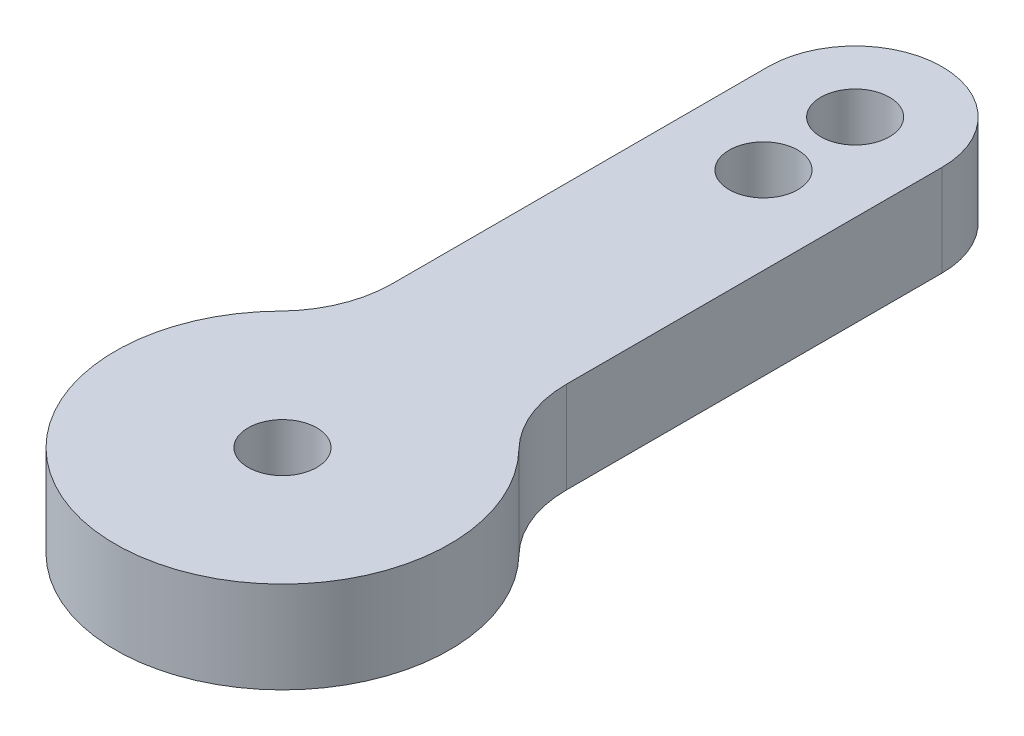
ISO-10303-21;
HEADER;
FILE_DESCRIPTION(('STEP AP214'),'2;1');
FILE_NAME('part.step','',(''),(''),'','','');
FILE_SCHEMA(('AUTOMOTIVE_DESIGN { 1 0 10303 214 1 1 1 1 }'));
ENDSEC;
DATA;
#1=APPLICATION_CONTEXT('core data for automotive mechanical design processes');
#2=APPLICATION_PROTOCOL_DEFINITION('international standard','automotive_design',2000,#1);
#3=PRODUCT_CONTEXT('',#1,'mechanical');
#4=PRODUCT('Part','Part','',(#3));
#5=PRODUCT_RELATED_PRODUCT_CATEGORY('part','',(#4));
#6=PRODUCT_DEFINITION_FORMATION('','',#4);
#7=PRODUCT_DEFINITION_CONTEXT('part definition',#1,'design');
#8=PRODUCT_DEFINITION('design','',#6,#7);
#9=PRODUCT_DEFINITION_SHAPE('','',#8);
#10=(LENGTH_UNIT() NAMED_UNIT(*) SI_UNIT(.MILLI.,.METRE.));
#11=(NAMED_UNIT(*) PLANE_ANGLE_UNIT() SI_UNIT($,.RADIAN.));
#12=(NAMED_UNIT(*) SI_UNIT($,.STERADIAN.) SOLID_ANGLE_UNIT());
#13=UNCERTAINTY_MEASURE_WITH_UNIT(LENGTH_MEASURE(1.E-05),#10,'distance_accuracy_value','');
#14=(GEOMETRIC_REPRESENTATION_CONTEXT(3) GLOBAL_UNCERTAINTY_ASSIGNED_CONTEXT((#13)) GLOBAL_UNIT_ASSIGNED_CONTEXT((#10,
#11,#12)) REPRESENTATION_CONTEXT('',''));
#15=CARTESIAN_POINT('',(0.,0.,0.));
#16=DIRECTION('',(0.,0.,1.));
#17=DIRECTION('',(1.,0.,0.));
#18=AXIS2_PLACEMENT_3D('',#15,#16,#17);
#19=CARTESIAN_POINT('',(8.8,0.,-8.59360227145753));
#20=DIRECTION('',(0.,1.,0.));
#21=DIRECTION('',(0.,0.,1.));
#22=AXIS2_PLACEMENT_3D('',#19,#20,#21);
#23=PLANE('',#22);
#24=CARTESIAN_POINT('',(0.,0.,0.));
#25=DIRECTION('',(0.,-1.,0.));
#26=DIRECTION('',(0.,0.,-1.));
#27=AXIS2_PLACEMENT_3D('',#24,#25,#26);
#28=CIRCLE('',#27,1.5);
#29=CARTESIAN_POINT('',(0.,0.,-1.5));
#30=VERTEX_POINT('',#29);
#31=EDGE_CURVE('E114',#30,#30,#28,.F.);
#32=ORIENTED_EDGE('',*,*,#31,.T.);
#33=EDGE_LOOP('',(#32));
#34=FACE_BOUND('',#33,.T.);
#35=CARTESIAN_POINT('',(0.,0.,-21.));
#36=DIRECTION('',(0.,-1.,0.));
#37=DIRECTION('',(0.,0.,-1.));
#38=AXIS2_PLACEMENT_3D('',#35,#36,#37);
#39=CIRCLE('',#38,1.5);
#40=CARTESIAN_POINT('',(0.,0.,-22.5));
#41=VERTEX_POINT('',#40);
#42=EDGE_CURVE('E20',#41,#41,#39,.F.);
#43=ORIENTED_EDGE('',*,*,#42,.T.);
#44=EDGE_LOOP('',(#43));
#45=FACE_BOUND('',#44,.T.);
#46=CARTESIAN_POINT('',(0.,0.,-25.));
#47=DIRECTION('',(0.,-1.,0.));
#48=DIRECTION('',(0.,0.,-1.));
#49=AXIS2_PLACEMENT_3D('',#46,#47,#48);
#50=CIRCLE('',#49,1.5);
#51=CARTESIAN_POINT('',(0.,0.,-26.5));
#52=VERTEX_POINT('',#51);
#53=EDGE_CURVE('E117',#52,#52,#50,.F.);
#54=ORIENTED_EDGE('',*,*,#53,.T.);
#55=EDGE_LOOP('',(#54));
#56=FACE_BOUND('',#55,.T.);
#57=CARTESIAN_POINT('',(0.,0.,0.));
#58=DIRECTION('',(0.,-1.,0.));
#59=DIRECTION('',(0.,0.,-1.));
#60=AXIS2_PLACEMENT_3D('',#57,#58,#59);
#61=CIRCLE('',#60,7.3);
#62=CARTESIAN_POINT('',(-5.22276422764228,0.,-5.10026801476747));
#63=VERTEX_POINT('',#62);
#64=CARTESIAN_POINT('',(5.22276422764228,0.,-5.10026801476747));
#65=VERTEX_POINT('',#64);
#66=EDGE_CURVE('E120',#63,#65,#61,.F.);
#67=ORIENTED_EDGE('',*,*,#66,.F.);
#68=CARTESIAN_POINT('',(-8.8,0.,-8.59360227145753));
#69=DIRECTION('',(0.,-1.,0.));
#70=DIRECTION('',(0.,0.,-1.));
#71=AXIS2_PLACEMENT_3D('',#68,#69,#70);
#72=CIRCLE('',#71,5.);
#73=CARTESIAN_POINT('',(-3.8,0.,-8.59360227145753));
#74=VERTEX_POINT('',#73);
#75=EDGE_CURVE('E122',#63,#74,#72,.F.);
#76=ORIENTED_EDGE('',*,*,#75,.T.);
#77=DIRECTION('',(0.,0.,-1.));
#78=VECTOR('',#77,1.);
#79=CARTESIAN_POINT('',(-3.8,0.,-25.));
#80=LINE('',#79,#78);
#81=CARTESIAN_POINT('',(-3.8,0.,-25.));
#82=VERTEX_POINT('',#81);
#83=EDGE_CURVE('E94',#74,#82,#80,.T.);
#84=ORIENTED_EDGE('',*,*,#83,.T.);
#85=CARTESIAN_POINT('',(0.,0.,-25.));
#86=DIRECTION('',(0.,-1.,0.));
#87=DIRECTION('',(0.,0.,-1.));
#88=AXIS2_PLACEMENT_3D('',#85,#86,#87);
#89=CIRCLE('',#88,3.8);
#90=CARTESIAN_POINT('',(3.8,0.,-25.));
#91=VERTEX_POINT('',#90);
#92=EDGE_CURVE('E81',#91,#82,#89,.F.);
#93=ORIENTED_EDGE('',*,*,#92,.F.);
#94=DIRECTION('',(0.,0.,1.));
#95=VECTOR('',#94,1.);
#96=CARTESIAN_POINT('',(3.8,0.,-25.));
#97=LINE('',#96,#95);
#98=CARTESIAN_POINT('',(3.8,0.,-8.59360227145753));
#99=VERTEX_POINT('',#98);
#100=EDGE_CURVE('E79',#91,#99,#97,.T.);
#101=ORIENTED_EDGE('',*,*,#100,.T.);
#102=CARTESIAN_POINT('',(8.8,0.,-8.59360227145753));
#103=DIRECTION('',(0.,-1.,0.));
#104=DIRECTION('',(0.,0.,-1.));
#105=AXIS2_PLACEMENT_3D('',#102,#103,#104);
#106=CIRCLE('',#105,5.);
#107=EDGE_CURVE('E68',#99,#65,#106,.F.);
#108=ORIENTED_EDGE('',*,*,#107,.T.);
#109=EDGE_LOOP('',(#67,#76,#84,#93,#101,#108));
#110=FACE_BOUND('',#109,.T.);
#111=ADVANCED_FACE('F17',(#34,#45,#56,#110),#23,.F.);
#112=CARTESIAN_POINT('',(0.,4.,-21.));
#113=DIRECTION('',(0.,-1.,0.));
#114=DIRECTION('',(0.,0.,-1.));
#115=AXIS2_PLACEMENT_3D('',#112,#113,#114);
#116=CYLINDRICAL_SURFACE('',#115,1.5);
#117=CARTESIAN_POINT('',(0.,4.,-21.));
#118=DIRECTION('',(0.,-1.,0.));
#119=DIRECTION('',(0.,0.,-1.));
#120=AXIS2_PLACEMENT_3D('',#117,#118,#119);
#121=CIRCLE('',#120,1.5);
#122=CARTESIAN_POINT('',(0.,4.,-22.5));
#123=VERTEX_POINT('',#122);
#124=EDGE_CURVE('E111',#123,#123,#121,.T.);
#125=ORIENTED_EDGE('',*,*,#124,.F.);
#126=EDGE_LOOP('',(#125));
#127=FACE_BOUND('',#126,.T.);
#128=ORIENTED_EDGE('',*,*,#42,.F.);
#129=EDGE_LOOP('',(#128));
#130=FACE_BOUND('',#129,.T.);
#131=ADVANCED_FACE('F173',(#127,#130),#116,.F.);
#132=CARTESIAN_POINT('',(8.8,4.,-8.59360227145753));
#133=DIRECTION('',(0.,-1.,0.));
#134=DIRECTION('',(0.,0.,-1.));
#135=AXIS2_PLACEMENT_3D('',#132,#133,#134);
#136=CYLINDRICAL_SURFACE('',#135,5.);
#137=DIRECTION('',(0.,1.,0.));
#138=VECTOR('',#137,1.);
#139=CARTESIAN_POINT('',(3.8,4.,-8.59360227145753));
#140=LINE('',#139,#138);
#141=CARTESIAN_POINT('',(3.8,4.,-8.59360227145753));
#142=VERTEX_POINT('',#141);
#143=EDGE_CURVE('E72',#99,#142,#140,.T.);
#144=ORIENTED_EDGE('',*,*,#143,.T.);
#145=CARTESIAN_POINT('',(8.8,4.,-8.59360227145753));
#146=DIRECTION('',(0.,-1.,0.));
#147=DIRECTION('',(0.,0.,-1.));
#148=AXIS2_PLACEMENT_3D('',#145,#146,#147);
#149=CIRCLE('',#148,5.);
#150=CARTESIAN_POINT('',(5.22276422764228,4.,-5.10026801476747));
#151=VERTEX_POINT('',#150);
#152=EDGE_CURVE('E109',#151,#142,#149,.T.);
#153=ORIENTED_EDGE('',*,*,#152,.F.);
#154=DIRECTION('',(0.,-1.,0.));
#155=VECTOR('',#154,1.);
#156=CARTESIAN_POINT('',(5.22276422764228,4.,-5.10026801476747));
#157=LINE('',#156,#155);
#158=EDGE_CURVE('E75',#65,#151,#157,.F.);
#159=ORIENTED_EDGE('',*,*,#158,.F.);
#160=ORIENTED_EDGE('',*,*,#107,.F.);
#161=EDGE_LOOP('',(#144,#153,#159,#160));
#162=FACE_BOUND('',#161,.T.);
#163=ADVANCED_FACE('F70',(#162),#136,.F.);
#164=CARTESIAN_POINT('',(3.8,4.,-25.));
#165=DIRECTION('',(-1.,0.,0.));
#166=DIRECTION('',(0.,0.,1.));
#167=AXIS2_PLACEMENT_3D('',#164,#165,#166);
#168=PLANE('',#167);
#169=DIRECTION('',(0.,-1.,0.));
#170=VECTOR('',#169,1.);
#171=CARTESIAN_POINT('',(3.8,4.,-25.));
#172=LINE('',#171,#170);
#173=CARTESIAN_POINT('',(3.8,4.,-25.));
#174=VERTEX_POINT('',#173);
#175=EDGE_CURVE('E84',#174,#91,#172,.T.);
#176=ORIENTED_EDGE('',*,*,#175,.F.);
#177=DIRECTION('',(0.,0.,1.));
#178=VECTOR('',#177,1.);
#179=CARTESIAN_POINT('',(3.8,4.,-8.59360227145753));
#180=LINE('',#179,#178);
#181=EDGE_CURVE('E88',#142,#174,#180,.F.);
#182=ORIENTED_EDGE('',*,*,#181,.F.);
#183=ORIENTED_EDGE('',*,*,#143,.F.);
#184=ORIENTED_EDGE('',*,*,#100,.F.);
#185=EDGE_LOOP('',(#176,#182,#183,#184));
#186=FACE_BOUND('',#185,.T.);
#187=ADVANCED_FACE('F86',(#186),#168,.F.);
#188=CARTESIAN_POINT('',(0.,4.,-25.));
#189=DIRECTION('',(0.,-1.,0.));
#190=DIRECTION('',(0.,0.,-1.));
#191=AXIS2_PLACEMENT_3D('',#188,#189,#190);
#192=CYLINDRICAL_SURFACE('',#191,3.8);
#193=ORIENTED_EDGE('',*,*,#92,.T.);
#194=DIRECTION('',(0.,1.,0.));
#195=VECTOR('',#194,1.);
#196=CARTESIAN_POINT('',(-3.8,4.,-25.));
#197=LINE('',#196,#195);
#198=CARTESIAN_POINT('',(-3.8,4.,-25.));
#199=VERTEX_POINT('',#198);
#200=EDGE_CURVE('E96',#82,#199,#197,.T.);
#201=ORIENTED_EDGE('',*,*,#200,.T.);
#202=CARTESIAN_POINT('',(0.,4.,-25.));
#203=DIRECTION('',(0.,-1.,0.));
#204=DIRECTION('',(0.,0.,-1.));
#205=AXIS2_PLACEMENT_3D('',#202,#203,#204);
#206=CIRCLE('',#205,3.8);
#207=EDGE_CURVE('E107',#174,#199,#206,.F.);
#208=ORIENTED_EDGE('',*,*,#207,.F.);
#209=ORIENTED_EDGE('',*,*,#175,.T.);
#210=EDGE_LOOP('',(#193,#201,#208,#209));
#211=FACE_BOUND('',#210,.T.);
#212=ADVANCED_FACE('F128',(#211),#192,.T.);
#213=CARTESIAN_POINT('',(-3.8,4.,-25.));
#214=DIRECTION('',(1.,0.,0.));
#215=DIRECTION('',(0.,0.,-1.));
#216=AXIS2_PLACEMENT_3D('',#213,#214,#215);
#217=PLANE('',#216);
#218=DIRECTION('',(0.,-1.,0.));
#219=VECTOR('',#218,1.);
#220=CARTESIAN_POINT('',(-3.8,4.,-8.59360227145753));
#221=LINE('',#220,#219);
#222=CARTESIAN_POINT('',(-3.8,4.,-8.59360227145753));
#223=VERTEX_POINT('',#222);
#224=EDGE_CURVE('E95',#74,#223,#221,.F.);
#225=ORIENTED_EDGE('',*,*,#224,.T.);
#226=DIRECTION('',(0.,0.,1.));
#227=VECTOR('',#226,1.);
#228=CARTESIAN_POINT('',(-3.8,4.,-8.59360227145753));
#229=LINE('',#228,#227);
#230=EDGE_CURVE('E106',#199,#223,#229,.T.);
#231=ORIENTED_EDGE('',*,*,#230,.F.);
#232=ORIENTED_EDGE('',*,*,#200,.F.);
#233=ORIENTED_EDGE('',*,*,#83,.F.);
#234=EDGE_LOOP('',(#225,#231,#232,#233));
#235=FACE_BOUND('',#234,.T.);
#236=ADVANCED_FACE('F142',(#235),#217,.F.);
#237=CARTESIAN_POINT('',(-8.8,4.,-8.59360227145753));
#238=DIRECTION('',(0.,-1.,0.));
#239=DIRECTION('',(0.,0.,-1.));
#240=AXIS2_PLACEMENT_3D('',#237,#238,#239);
#241=CYLINDRICAL_SURFACE('',#240,5.);
#242=DIRECTION('',(0.,-1.,0.));
#243=VECTOR('',#242,1.);
#244=CARTESIAN_POINT('',(-5.22276422764228,4.,-5.10026801476747));
#245=LINE('',#244,#243);
#246=CARTESIAN_POINT('',(-5.22276422764228,4.,-5.10026801476747));
#247=VERTEX_POINT('',#246);
#248=EDGE_CURVE('E35',#247,#63,#245,.T.);
#249=ORIENTED_EDGE('',*,*,#248,.F.);
#250=CARTESIAN_POINT('',(-8.8,4.,-8.59360227145753));
#251=DIRECTION('',(0.,-1.,0.));
#252=DIRECTION('',(0.,0.,-1.));
#253=AXIS2_PLACEMENT_3D('',#250,#251,#252);
#254=CIRCLE('',#253,5.);
#255=EDGE_CURVE('E103',#223,#247,#254,.T.);
#256=ORIENTED_EDGE('',*,*,#255,.F.);
#257=ORIENTED_EDGE('',*,*,#224,.F.);
#258=ORIENTED_EDGE('',*,*,#75,.F.);
#259=EDGE_LOOP('',(#249,#256,#257,#258));
#260=FACE_BOUND('',#259,.T.);
#261=ADVANCED_FACE('F143',(#260),#241,.F.);
#262=CARTESIAN_POINT('',(0.,4.,0.));
#263=DIRECTION('',(0.,-1.,0.));
#264=DIRECTION('',(0.,0.,-1.));
#265=AXIS2_PLACEMENT_3D('',#262,#263,#264);
#266=CYLINDRICAL_SURFACE('',#265,7.3);
#267=CARTESIAN_POINT('',(0.,4.,0.));
#268=DIRECTION('',(0.,-1.,0.));
#269=DIRECTION('',(0.,0.,-1.));
#270=AXIS2_PLACEMENT_3D('',#267,#268,#269);
#271=CIRCLE('',#270,7.3);
#272=EDGE_CURVE('E100',#247,#151,#271,.F.);
#273=ORIENTED_EDGE('',*,*,#272,.F.);
#274=ORIENTED_EDGE('',*,*,#248,.T.);
#275=ORIENTED_EDGE('',*,*,#66,.T.);
#276=ORIENTED_EDGE('',*,*,#158,.T.);
#277=EDGE_LOOP('',(#273,#274,#275,#276));
#278=FACE_BOUND('',#277,.T.);
#279=ADVANCED_FACE('F145',(#278),#266,.T.);
#280=CARTESIAN_POINT('',(0.,4.,-25.));
#281=DIRECTION('',(0.,-1.,0.));
#282=DIRECTION('',(0.,0.,-1.));
#283=AXIS2_PLACEMENT_3D('',#280,#281,#282);
#284=CYLINDRICAL_SURFACE('',#283,1.5);
#285=CARTESIAN_POINT('',(0.,4.,-25.));
#286=DIRECTION('',(0.,-1.,0.));
#287=DIRECTION('',(0.,0.,-1.));
#288=AXIS2_PLACEMENT_3D('',#285,#286,#287);
#289=CIRCLE('',#288,1.5);
#290=CARTESIAN_POINT('',(0.,4.,-26.5));
#291=VERTEX_POINT('',#290);
#292=EDGE_CURVE('E26',#291,#291,#289,.T.);
#293=ORIENTED_EDGE('',*,*,#292,.F.);
#294=EDGE_LOOP('',(#293));
#295=FACE_BOUND('',#294,.T.);
#296=ORIENTED_EDGE('',*,*,#53,.F.);
#297=EDGE_LOOP('',(#296));
#298=FACE_BOUND('',#297,.T.);
#299=ADVANCED_FACE('F147',(#295,#298),#284,.F.);
#300=CARTESIAN_POINT('',(0.,4.,0.));
#301=DIRECTION('',(0.,-1.,0.));
#302=DIRECTION('',(0.,0.,-1.));
#303=AXIS2_PLACEMENT_3D('',#300,#301,#302);
#304=CYLINDRICAL_SURFACE('',#303,1.5);
#305=CARTESIAN_POINT('',(0.,4.,0.));
#306=DIRECTION('',(0.,-1.,0.));
#307=DIRECTION('',(0.,0.,-1.));
#308=AXIS2_PLACEMENT_3D('',#305,#306,#307);
#309=CIRCLE('',#308,1.5);
#310=CARTESIAN_POINT('',(0.,4.,-1.5));
#311=VERTEX_POINT('',#310);
#312=EDGE_CURVE('E11',#311,#311,#309,.T.);
#313=ORIENTED_EDGE('',*,*,#312,.F.);
#314=EDGE_LOOP('',(#313));
#315=FACE_BOUND('',#314,.T.);
#316=ORIENTED_EDGE('',*,*,#31,.F.);
#317=EDGE_LOOP('',(#316));
#318=FACE_BOUND('',#317,.T.);
#319=ADVANCED_FACE('F154',(#315,#318),#304,.F.);
#320=CARTESIAN_POINT('',(8.8,4.,-8.59360227145753));
#321=DIRECTION('',(0.,1.,0.));
#322=DIRECTION('',(0.,0.,1.));
#323=AXIS2_PLACEMENT_3D('',#320,#321,#322);
#324=PLANE('',#323);
#325=ORIENTED_EDGE('',*,*,#312,.T.);
#326=EDGE_LOOP('',(#325));
#327=FACE_BOUND('',#326,.T.);
#328=ORIENTED_EDGE('',*,*,#292,.T.);
#329=EDGE_LOOP('',(#328));
#330=FACE_BOUND('',#329,.T.);
#331=ORIENTED_EDGE('',*,*,#255,.T.);
#332=ORIENTED_EDGE('',*,*,#272,.T.);
#333=ORIENTED_EDGE('',*,*,#152,.T.);
#334=ORIENTED_EDGE('',*,*,#181,.T.);
#335=ORIENTED_EDGE('',*,*,#207,.T.);
#336=ORIENTED_EDGE('',*,*,#230,.T.);
#337=EDGE_LOOP('',(#331,#332,#333,#334,#335,#336));
#338=FACE_BOUND('',#337,.T.);
#339=ORIENTED_EDGE('',*,*,#124,.T.);
#340=EDGE_LOOP('',(#339));
#341=FACE_BOUND('',#340,.T.);
#342=ADVANCED_FACE('F133',(#327,#330,#338,#341),#324,.T.);
#343=CLOSED_SHELL('',(#111,#131,#163,#187,#212,#236,#261,#279,#299,#319,#342));
#344=MANIFOLD_SOLID_BREP('B1',#343);
#345=ADVANCED_BREP_SHAPE_REPRESENTATION('',(#18,#344),#14);
#346=SHAPE_DEFINITION_REPRESENTATION(#9,#345);
ENDSEC;
END-ISO-10303-21;
